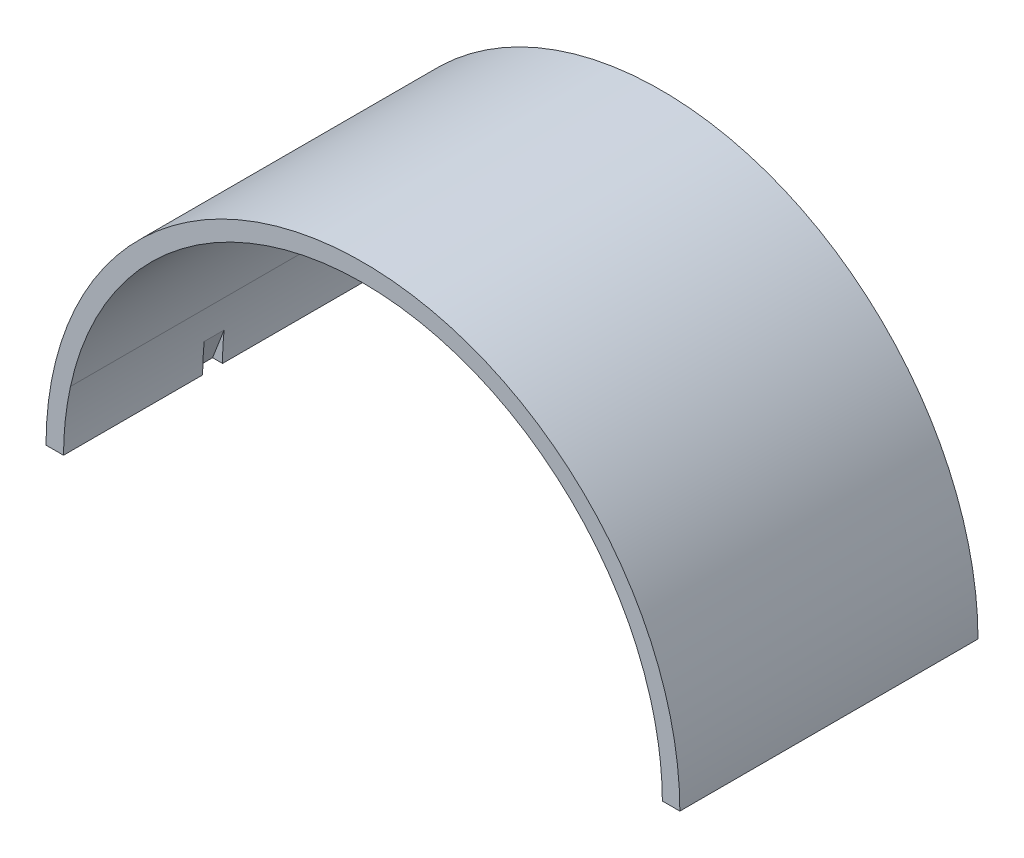
ISO-10303-21;
HEADER;
FILE_DESCRIPTION(('STEP AP214'),'2;1');
FILE_NAME('part.step','',(''),(''),'','','');
FILE_SCHEMA(('AUTOMOTIVE_DESIGN { 1 0 10303 214 1 1 1 1 }'));
ENDSEC;
DATA;
#1=APPLICATION_CONTEXT('core data for automotive mechanical design processes');
#2=APPLICATION_PROTOCOL_DEFINITION('international standard','automotive_design',2000,#1);
#3=PRODUCT_CONTEXT('',#1,'mechanical');
#4=PRODUCT('Part','Part','',(#3));
#5=PRODUCT_RELATED_PRODUCT_CATEGORY('part','',(#4));
#6=PRODUCT_DEFINITION_FORMATION('','',#4);
#7=PRODUCT_DEFINITION_CONTEXT('part definition',#1,'design');
#8=PRODUCT_DEFINITION('design','',#6,#7);
#9=PRODUCT_DEFINITION_SHAPE('','',#8);
#10=(LENGTH_UNIT() NAMED_UNIT(*) SI_UNIT(.MILLI.,.METRE.));
#11=(NAMED_UNIT(*) PLANE_ANGLE_UNIT() SI_UNIT($,.RADIAN.));
#12=(NAMED_UNIT(*) SI_UNIT($,.STERADIAN.) SOLID_ANGLE_UNIT());
#13=UNCERTAINTY_MEASURE_WITH_UNIT(LENGTH_MEASURE(1.E-05),#10,'distance_accuracy_value','');
#14=(GEOMETRIC_REPRESENTATION_CONTEXT(3) GLOBAL_UNCERTAINTY_ASSIGNED_CONTEXT((#13)) GLOBAL_UNIT_ASSIGNED_CONTEXT((#10,
#11,#12)) REPRESENTATION_CONTEXT('',''));
#15=CARTESIAN_POINT('',(0.,0.,0.));
#16=DIRECTION('',(0.,0.,1.));
#17=DIRECTION('',(1.,0.,0.));
#18=AXIS2_PLACEMENT_3D('',#15,#16,#17);
#19=CARTESIAN_POINT('',(-31.891178343949,0.,15.));
#20=DIRECTION('',(0.,1.,0.));
#21=DIRECTION('',(0.,0.,1.));
#22=AXIS2_PLACEMENT_3D('',#19,#20,#21);
#23=PLANE('',#22);
#24=DIRECTION('',(1.,0.,0.));
#25=VECTOR('',#24,1.);
#26=CARTESIAN_POINT('',(-30.5165696324547,0.,-0.999999999999994));
#27=LINE('',#26,#25);
#28=CARTESIAN_POINT('',(-31.129278343949,0.,-0.999999999999994));
#29=VERTEX_POINT('',#28);
#30=CARTESIAN_POINT('',(-30.129278343949,0.,-0.999999999999994));
#31=VERTEX_POINT('',#30);
#32=EDGE_CURVE('E151',#29,#31,#27,.T.);
#33=ORIENTED_EDGE('',*,*,#32,.F.);
#34=DIRECTION('',(0.,0.,-1.));
#35=VECTOR('',#34,1.);
#36=CARTESIAN_POINT('',(-31.129278343949,0.,-0.999999999999994));
#37=LINE('',#36,#35);
#38=CARTESIAN_POINT('',(-31.129278343949,0.,1.00000000000001));
#39=VERTEX_POINT('',#38);
#40=EDGE_CURVE('E149',#39,#29,#37,.T.);
#41=ORIENTED_EDGE('',*,*,#40,.F.);
#42=DIRECTION('',(-1.,0.,0.));
#43=VECTOR('',#42,1.);
#44=CARTESIAN_POINT('',(-30.5165696324547,0.,1.00000000000001));
#45=LINE('',#44,#43);
#46=CARTESIAN_POINT('',(-30.129278343949,0.,1.00000000000001));
#47=VERTEX_POINT('',#46);
#48=EDGE_CURVE('E136',#47,#39,#45,.T.);
#49=ORIENTED_EDGE('',*,*,#48,.F.);
#50=DIRECTION('',(0.,0.,-1.));
#51=VECTOR('',#50,1.);
#52=CARTESIAN_POINT('',(-30.129278343949,0.,15.));
#53=LINE('',#52,#51);
#54=CARTESIAN_POINT('',(-30.129278343949,0.,15.));
#55=VERTEX_POINT('',#54);
#56=EDGE_CURVE('E147',#55,#47,#53,.T.);
#57=ORIENTED_EDGE('',*,*,#56,.F.);
#58=DIRECTION('',(1.,0.,0.));
#59=VECTOR('',#58,1.);
#60=CARTESIAN_POINT('',(-31.891178343949,0.,15.));
#61=LINE('',#60,#59);
#62=CARTESIAN_POINT('',(-31.891178343949,0.,15.));
#63=VERTEX_POINT('',#62);
#64=EDGE_CURVE('E172',#63,#55,#61,.T.);
#65=ORIENTED_EDGE('',*,*,#64,.F.);
#66=DIRECTION('',(0.,0.,-1.));
#67=VECTOR('',#66,1.);
#68=CARTESIAN_POINT('',(-31.891178343949,0.,15.));
#69=LINE('',#68,#67);
#70=CARTESIAN_POINT('',(-31.891178343949,0.,1.));
#71=VERTEX_POINT('',#70);
#72=EDGE_CURVE('E11',#63,#71,#69,.T.);
#73=ORIENTED_EDGE('',*,*,#72,.T.);
#74=DIRECTION('',(1.,0.,0.));
#75=VECTOR('',#74,1.);
#76=CARTESIAN_POINT('',(-31.891178343949,0.,1.));
#77=LINE('',#76,#75);
#78=CARTESIAN_POINT('',(-32.891178343949,0.,1.));
#79=VERTEX_POINT('',#78);
#80=EDGE_CURVE('E253',#79,#71,#77,.T.);
#81=ORIENTED_EDGE('',*,*,#80,.F.);
#82=DIRECTION('',(0.,0.,1.));
#83=VECTOR('',#82,1.);
#84=CARTESIAN_POINT('',(-32.891178343949,0.,-1.));
#85=LINE('',#84,#83);
#86=CARTESIAN_POINT('',(-32.891178343949,0.,-1.));
#87=VERTEX_POINT('',#86);
#88=EDGE_CURVE('E264',#87,#79,#85,.T.);
#89=ORIENTED_EDGE('',*,*,#88,.F.);
#90=DIRECTION('',(-1.,0.,0.));
#91=VECTOR('',#90,1.);
#92=CARTESIAN_POINT('',(-31.891178343949,0.,-1.));
#93=LINE('',#92,#91);
#94=CARTESIAN_POINT('',(-31.891178343949,0.,-1.));
#95=VERTEX_POINT('',#94);
#96=EDGE_CURVE('E193',#95,#87,#93,.T.);
#97=ORIENTED_EDGE('',*,*,#96,.F.);
#98=CARTESIAN_POINT('',(-31.891178343949,0.,-15.));
#99=VERTEX_POINT('',#98);
#100=EDGE_CURVE('E52',#95,#99,#69,.T.);
#101=ORIENTED_EDGE('',*,*,#100,.T.);
#102=DIRECTION('',(1.,0.,0.));
#103=VECTOR('',#102,1.);
#104=CARTESIAN_POINT('',(-31.891178343949,0.,-15.));
#105=LINE('',#104,#103);
#106=CARTESIAN_POINT('',(-30.129278343949,0.,-15.));
#107=VERTEX_POINT('',#106);
#108=EDGE_CURVE('E180',#99,#107,#105,.T.);
#109=ORIENTED_EDGE('',*,*,#108,.T.);
#110=EDGE_CURVE('E157',#31,#107,#53,.T.);
#111=ORIENTED_EDGE('',*,*,#110,.F.);
#112=EDGE_LOOP('',(#33,#41,#49,#57,#65,#73,#81,#89,#97,#101,#109,#111));
#113=FACE_BOUND('',#112,.T.);
#114=ADVANCED_FACE('F44',(#113),#23,.F.);
#115=CARTESIAN_POINT('',(0.,-0.116742127165869,15.));
#116=DIRECTION('',(0.,0.,-1.));
#117=DIRECTION('',(-1.,0.,0.));
#118=AXIS2_PLACEMENT_3D('',#115,#116,#117);
#119=CYLINDRICAL_SURFACE('',#118,30.1295045138716);
#120=CARTESIAN_POINT('',(0.,-0.116742127165869,1.00000000000001));
#121=DIRECTION('',(0.,0.,1.));
#122=DIRECTION('',(1.,0.,0.));
#123=AXIS2_PLACEMENT_3D('',#120,#121,#122);
#124=CIRCLE('',#123,30.1295045138716);
#125=CARTESIAN_POINT('',(-29.9678654689346,2.99999999999989,1.00000000000001));
#126=VERTEX_POINT('',#125);
#127=EDGE_CURVE('E133',#126,#47,#124,.T.);
#128=ORIENTED_EDGE('',*,*,#127,.F.);
#129=DIRECTION('',(0.,0.,-1.));
#130=VECTOR('',#129,1.);
#131=CARTESIAN_POINT('',(-29.9678654689346,2.99999999999989,15.));
#132=LINE('',#131,#130);
#133=CARTESIAN_POINT('',(-29.9678654689346,2.99999999999987,-0.999999999999994));
#134=VERTEX_POINT('',#133);
#135=EDGE_CURVE('E142',#134,#126,#132,.F.);
#136=ORIENTED_EDGE('',*,*,#135,.F.);
#137=CARTESIAN_POINT('',(0.,-0.116742127165869,-0.999999999999994));
#138=DIRECTION('',(0.,0.,-1.));
#139=DIRECTION('',(-1.,0.,0.));
#140=AXIS2_PLACEMENT_3D('',#137,#138,#139);
#141=CIRCLE('',#140,30.1295045138716);
#142=EDGE_CURVE('E141',#31,#134,#141,.T.);
#143=ORIENTED_EDGE('',*,*,#142,.F.);
#144=ORIENTED_EDGE('',*,*,#110,.T.);
#145=CARTESIAN_POINT('',(0.,-0.116742127165869,-15.));
#146=DIRECTION('',(0.,0.,-1.));
#147=DIRECTION('',(-1.,0.,0.));
#148=AXIS2_PLACEMENT_3D('',#145,#146,#147);
#149=CIRCLE('',#148,30.1295045138716);
#150=CARTESIAN_POINT('',(-29.4273391340799,6.35,-15.));
#151=VERTEX_POINT('',#150);
#152=EDGE_CURVE('E198',#107,#151,#149,.T.);
#153=ORIENTED_EDGE('',*,*,#152,.T.);
#154=DIRECTION('',(0.,0.,-1.));
#155=VECTOR('',#154,1.);
#156=CARTESIAN_POINT('',(-29.4273391340799,6.35,15.));
#157=LINE('',#156,#155);
#158=CARTESIAN_POINT('',(-29.4273391340799,6.35,15.));
#159=VERTEX_POINT('',#158);
#160=EDGE_CURVE('E162',#159,#151,#157,.T.);
#161=ORIENTED_EDGE('',*,*,#160,.F.);
#162=CARTESIAN_POINT('',(0.,-0.116742127165869,15.));
#163=DIRECTION('',(0.,0.,-1.));
#164=DIRECTION('',(-1.,0.,0.));
#165=AXIS2_PLACEMENT_3D('',#162,#163,#164);
#166=CIRCLE('',#165,30.1295045138716);
#167=EDGE_CURVE('E155',#55,#159,#166,.T.);
#168=ORIENTED_EDGE('',*,*,#167,.F.);
#169=ORIENTED_EDGE('',*,*,#56,.T.);
#170=EDGE_LOOP('',(#128,#136,#143,#144,#153,#161,#168,#169));
#171=FACE_BOUND('',#170,.T.);
#172=ADVANCED_FACE('F153',(#171),#119,.F.);
#173=CARTESIAN_POINT('',(0.,0.,15.));
#174=DIRECTION('',(0.,0.,-1.));
#175=DIRECTION('',(-1.,0.,0.));
#176=AXIS2_PLACEMENT_3D('',#173,#174,#175);
#177=CYLINDRICAL_SURFACE('',#176,31.891178343949);
#178=DIRECTION('',(0.,0.,1.));
#179=VECTOR('',#178,1.);
#180=CARTESIAN_POINT('',(-31.7497599387076,3.,-1.));
#181=LINE('',#180,#179);
#182=CARTESIAN_POINT('',(-31.7497599387076,3.,-1.));
#183=VERTEX_POINT('',#182);
#184=CARTESIAN_POINT('',(-31.7497599387076,3.,1.));
#185=VERTEX_POINT('',#184);
#186=EDGE_CURVE('E201',#183,#185,#181,.T.);
#187=ORIENTED_EDGE('',*,*,#186,.T.);
#188=CARTESIAN_POINT('',(0.,0.,0.999999999999994));
#189=DIRECTION('',(0.,0.,1.));
#190=DIRECTION('',(1.,0.,0.));
#191=AXIS2_PLACEMENT_3D('',#188,#189,#190);
#192=CIRCLE('',#191,31.891178343949);
#193=EDGE_CURVE('E236',#185,#71,#192,.T.);
#194=ORIENTED_EDGE('',*,*,#193,.T.);
#195=ORIENTED_EDGE('',*,*,#72,.F.);
#196=CARTESIAN_POINT('',(0.,0.,15.));
#197=DIRECTION('',(0.,0.,1.));
#198=DIRECTION('',(-1.,0.,0.));
#199=AXIS2_PLACEMENT_3D('',#196,#197,#198);
#200=CIRCLE('',#199,31.891178343949);
#201=CARTESIAN_POINT('',(31.891178343949,0.,15.));
#202=VERTEX_POINT('',#201);
#203=EDGE_CURVE('E169',#202,#63,#200,.T.);
#204=ORIENTED_EDGE('',*,*,#203,.F.);
#205=DIRECTION('',(0.,0.,-1.));
#206=VECTOR('',#205,1.);
#207=CARTESIAN_POINT('',(31.891178343949,0.,15.));
#208=LINE('',#207,#206);
#209=CARTESIAN_POINT('',(31.891178343949,0.,-15.));
#210=VERTEX_POINT('',#209);
#211=EDGE_CURVE('E177',#202,#210,#208,.T.);
#212=ORIENTED_EDGE('',*,*,#211,.T.);
#213=CARTESIAN_POINT('',(0.,0.,-15.));
#214=DIRECTION('',(0.,0.,1.));
#215=DIRECTION('',(-1.,0.,0.));
#216=AXIS2_PLACEMENT_3D('',#213,#214,#215);
#217=CIRCLE('',#216,31.891178343949);
#218=EDGE_CURVE('E168',#210,#99,#217,.T.);
#219=ORIENTED_EDGE('',*,*,#218,.T.);
#220=ORIENTED_EDGE('',*,*,#100,.F.);
#221=CARTESIAN_POINT('',(0.,0.,-1.00000000000001));
#222=DIRECTION('',(0.,0.,-1.));
#223=DIRECTION('',(-1.,0.,0.));
#224=AXIS2_PLACEMENT_3D('',#221,#222,#223);
#225=CIRCLE('',#224,31.891178343949);
#226=EDGE_CURVE('E258',#95,#183,#225,.T.);
#227=ORIENTED_EDGE('',*,*,#226,.T.);
#228=EDGE_LOOP('',(#187,#194,#195,#204,#212,#219,#220,#227));
#229=FACE_BOUND('',#228,.T.);
#230=ADVANCED_FACE('F46',(#229),#177,.T.);
#231=CARTESIAN_POINT('',(30.472178343949,0.,15.));
#232=DIRECTION('',(0.,1.,0.));
#233=DIRECTION('',(0.,0.,1.));
#234=AXIS2_PLACEMENT_3D('',#231,#232,#233);
#235=PLANE('',#234);
#236=DIRECTION('',(1.,0.,0.));
#237=VECTOR('',#236,1.);
#238=CARTESIAN_POINT('',(30.472178343949,0.,-15.));
#239=LINE('',#238,#237);
#240=CARTESIAN_POINT('',(30.129278343949,0.,-15.));
#241=VERTEX_POINT('',#240);
#242=EDGE_CURVE('E173',#241,#210,#239,.T.);
#243=ORIENTED_EDGE('',*,*,#242,.T.);
#244=ORIENTED_EDGE('',*,*,#211,.F.);
#245=DIRECTION('',(1.,0.,0.));
#246=VECTOR('',#245,1.);
#247=CARTESIAN_POINT('',(30.472178343949,0.,15.));
#248=LINE('',#247,#246);
#249=CARTESIAN_POINT('',(30.129278343949,0.,15.));
#250=VERTEX_POINT('',#249);
#251=EDGE_CURVE('E175',#250,#202,#248,.T.);
#252=ORIENTED_EDGE('',*,*,#251,.F.);
#253=DIRECTION('',(0.,0.,-1.));
#254=VECTOR('',#253,1.);
#255=CARTESIAN_POINT('',(30.129278343949,0.,15.));
#256=LINE('',#255,#254);
#257=EDGE_CURVE('E156',#250,#241,#256,.T.);
#258=ORIENTED_EDGE('',*,*,#257,.T.);
#259=EDGE_LOOP('',(#243,#244,#252,#258));
#260=FACE_BOUND('',#259,.T.);
#261=ADVANCED_FACE('F203',(#260),#235,.F.);
#262=CARTESIAN_POINT('',(0.,0.,15.));
#263=DIRECTION('',(0.,0.,-1.));
#264=DIRECTION('',(-1.,0.,0.));
#265=AXIS2_PLACEMENT_3D('',#262,#263,#264);
#266=PLANE('',#265);
#267=ORIENTED_EDGE('',*,*,#203,.T.);
#268=ORIENTED_EDGE('',*,*,#64,.T.);
#269=ORIENTED_EDGE('',*,*,#167,.T.);
#270=CARTESIAN_POINT('',(0.,0.,15.));
#271=DIRECTION('',(0.,0.,-1.));
#272=DIRECTION('',(1.,0.,0.));
#273=AXIS2_PLACEMENT_3D('',#270,#271,#272);
#274=ELLIPSE('',#273,30.1052922759765,30.091178343949);
#275=CARTESIAN_POINT('',(29.4273391340799,6.35,15.));
#276=VERTEX_POINT('',#275);
#277=EDGE_CURVE('E230',#159,#276,#274,.T.);
#278=ORIENTED_EDGE('',*,*,#277,.T.);
#279=CARTESIAN_POINT('',(0.,-0.116742127165869,15.));
#280=DIRECTION('',(0.,0.,-1.));
#281=DIRECTION('',(-1.,0.,0.));
#282=AXIS2_PLACEMENT_3D('',#279,#280,#281);
#283=CIRCLE('',#282,30.1295045138716);
#284=EDGE_CURVE('E235',#276,#250,#283,.T.);
#285=ORIENTED_EDGE('',*,*,#284,.T.);
#286=ORIENTED_EDGE('',*,*,#251,.T.);
#287=EDGE_LOOP('',(#267,#268,#269,#278,#285,#286));
#288=FACE_BOUND('',#287,.T.);
#289=ADVANCED_FACE('F209',(#288),#266,.F.);
#290=CARTESIAN_POINT('',(0.,0.,-15.));
#291=DIRECTION('',(0.,0.,-1.));
#292=DIRECTION('',(-1.,0.,0.));
#293=AXIS2_PLACEMENT_3D('',#290,#291,#292);
#294=PLANE('',#293);
#295=ORIENTED_EDGE('',*,*,#218,.F.);
#296=ORIENTED_EDGE('',*,*,#242,.F.);
#297=CARTESIAN_POINT('',(0.,-0.116742127165869,-15.));
#298=DIRECTION('',(0.,0.,-1.));
#299=DIRECTION('',(-1.,0.,0.));
#300=AXIS2_PLACEMENT_3D('',#297,#298,#299);
#301=CIRCLE('',#300,30.1295045138716);
#302=CARTESIAN_POINT('',(29.4273391340799,6.35,-15.));
#303=VERTEX_POINT('',#302);
#304=EDGE_CURVE('E244',#303,#241,#301,.T.);
#305=ORIENTED_EDGE('',*,*,#304,.F.);
#306=CARTESIAN_POINT('',(0.,0.,-15.));
#307=DIRECTION('',(0.,0.,-1.));
#308=DIRECTION('',(1.,0.,0.));
#309=AXIS2_PLACEMENT_3D('',#306,#307,#308);
#310=ELLIPSE('',#309,30.1052922759765,30.091178343949);
#311=EDGE_CURVE('E241',#151,#303,#310,.T.);
#312=ORIENTED_EDGE('',*,*,#311,.F.);
#313=ORIENTED_EDGE('',*,*,#152,.F.);
#314=ORIENTED_EDGE('',*,*,#108,.F.);
#315=EDGE_LOOP('',(#295,#296,#305,#312,#313,#314));
#316=FACE_BOUND('',#315,.T.);
#317=ADVANCED_FACE('F196',(#316),#294,.T.);
#318=DIRECTION('',(0.,0.,-1.));
#319=VECTOR('',#318,1.);
#320=SURFACE_OF_LINEAR_EXTRUSION('',#274,#319);
#321=ORIENTED_EDGE('',*,*,#311,.T.);
#322=DIRECTION('',(0.,0.,-1.));
#323=VECTOR('',#322,1.);
#324=CARTESIAN_POINT('',(29.4273391340799,6.35,15.));
#325=LINE('',#324,#323);
#326=EDGE_CURVE('E160',#276,#303,#325,.T.);
#327=ORIENTED_EDGE('',*,*,#326,.F.);
#328=ORIENTED_EDGE('',*,*,#277,.F.);
#329=ORIENTED_EDGE('',*,*,#160,.T.);
#330=EDGE_LOOP('',(#321,#327,#328,#329));
#331=FACE_BOUND('',#330,.T.);
#332=ADVANCED_FACE('F221',(#331),#320,.F.);
#333=CARTESIAN_POINT('',(0.,-0.116742127165869,15.));
#334=DIRECTION('',(0.,0.,-1.));
#335=DIRECTION('',(-1.,0.,0.));
#336=AXIS2_PLACEMENT_3D('',#333,#334,#335);
#337=CYLINDRICAL_SURFACE('',#336,30.1295045138716);
#338=ORIENTED_EDGE('',*,*,#304,.T.);
#339=ORIENTED_EDGE('',*,*,#257,.F.);
#340=ORIENTED_EDGE('',*,*,#284,.F.);
#341=ORIENTED_EDGE('',*,*,#326,.T.);
#342=EDGE_LOOP('',(#338,#339,#340,#341));
#343=FACE_BOUND('',#342,.T.);
#344=ADVANCED_FACE('F228',(#343),#337,.F.);
#345=CARTESIAN_POINT('',(-31.891178343949,0.,1.));
#346=DIRECTION('',(0.,0.,1.));
#347=DIRECTION('',(1.,0.,0.));
#348=AXIS2_PLACEMENT_3D('',#345,#346,#347);
#349=PLANE('',#348);
#350=ORIENTED_EDGE('',*,*,#193,.F.);
#351=DIRECTION('',(0.355603869688965,0.934636767874148,0.));
#352=VECTOR('',#351,1.);
#353=CARTESIAN_POINT('',(-32.891178343949,0.,1.));
#354=LINE('',#353,#352);
#355=EDGE_CURVE('E259',#79,#185,#354,.T.);
#356=ORIENTED_EDGE('',*,*,#355,.F.);
#357=ORIENTED_EDGE('',*,*,#80,.T.);
#358=EDGE_LOOP('',(#350,#356,#357));
#359=FACE_BOUND('',#358,.T.);
#360=ADVANCED_FACE('F291',(#359),#349,.T.);
#361=CARTESIAN_POINT('',(-31.891178343949,0.,-1.));
#362=DIRECTION('',(0.,0.,-1.));
#363=DIRECTION('',(-1.,0.,0.));
#364=AXIS2_PLACEMENT_3D('',#361,#362,#363);
#365=PLANE('',#364);
#366=ORIENTED_EDGE('',*,*,#226,.F.);
#367=ORIENTED_EDGE('',*,*,#96,.T.);
#368=DIRECTION('',(0.355603869688965,0.934636767874148,0.));
#369=VECTOR('',#368,1.);
#370=CARTESIAN_POINT('',(-32.891178343949,0.,-1.));
#371=LINE('',#370,#369);
#372=EDGE_CURVE('E67',#87,#183,#371,.T.);
#373=ORIENTED_EDGE('',*,*,#372,.T.);
#374=EDGE_LOOP('',(#366,#367,#373));
#375=FACE_BOUND('',#374,.T.);
#376=ADVANCED_FACE('F289',(#375),#365,.T.);
#377=CARTESIAN_POINT('',(-32.891178343949,0.,-1.));
#378=DIRECTION('',(-0.934636767874148,0.355603869688965,0.));
#379=DIRECTION('',(-0.355603869688965,-0.934636767874148,0.));
#380=AXIS2_PLACEMENT_3D('',#377,#378,#379);
#381=PLANE('',#380);
#382=ORIENTED_EDGE('',*,*,#355,.T.);
#383=ORIENTED_EDGE('',*,*,#186,.F.);
#384=ORIENTED_EDGE('',*,*,#372,.F.);
#385=ORIENTED_EDGE('',*,*,#88,.T.);
#386=EDGE_LOOP('',(#382,#383,#384,#385));
#387=FACE_BOUND('',#386,.T.);
#388=ADVANCED_FACE('F287',(#387),#381,.T.);
#389=CARTESIAN_POINT('',(-30.5165696324547,-1.00039692215622,-0.999999999999994));
#390=DIRECTION('',(0.,0.,-1.));
#391=DIRECTION('',(-1.,0.,0.));
#392=AXIS2_PLACEMENT_3D('',#389,#390,#391);
#393=PLANE('',#392);
#394=ORIENTED_EDGE('',*,*,#142,.T.);
#395=DIRECTION('',(0.361027233469725,0.932555272728216,0.));
#396=VECTOR('',#395,1.);
#397=CARTESIAN_POINT('',(-31.5165696324547,-1.00039692215622,-0.999999999999994));
#398=LINE('',#397,#396);
#399=EDGE_CURVE('E150',#29,#134,#398,.T.);
#400=ORIENTED_EDGE('',*,*,#399,.F.);
#401=ORIENTED_EDGE('',*,*,#32,.T.);
#402=EDGE_LOOP('',(#394,#400,#401));
#403=FACE_BOUND('',#402,.T.);
#404=ADVANCED_FACE('F276',(#403),#393,.F.);
#405=CARTESIAN_POINT('',(-30.5165696324547,-1.00039692215622,1.00000000000001));
#406=DIRECTION('',(0.,0.,1.));
#407=DIRECTION('',(1.,0.,0.));
#408=AXIS2_PLACEMENT_3D('',#405,#406,#407);
#409=PLANE('',#408);
#410=ORIENTED_EDGE('',*,*,#127,.T.);
#411=ORIENTED_EDGE('',*,*,#48,.T.);
#412=DIRECTION('',(0.361027233469725,0.932555272728216,0.));
#413=VECTOR('',#412,1.);
#414=CARTESIAN_POINT('',(-31.5165696324547,-1.00039692215622,1.00000000000001));
#415=LINE('',#414,#413);
#416=EDGE_CURVE('E59',#39,#126,#415,.T.);
#417=ORIENTED_EDGE('',*,*,#416,.T.);
#418=EDGE_LOOP('',(#410,#411,#417));
#419=FACE_BOUND('',#418,.T.);
#420=ADVANCED_FACE('F135',(#419),#409,.F.);
#421=CARTESIAN_POINT('',(-31.5165696324547,-1.00039692215622,-0.999999999999994));
#422=DIRECTION('',(-0.932555272728216,0.361027233469725,0.));
#423=DIRECTION('',(-0.361027233469725,-0.932555272728216,0.));
#424=AXIS2_PLACEMENT_3D('',#421,#422,#423);
#425=PLANE('',#424);
#426=ORIENTED_EDGE('',*,*,#135,.T.);
#427=ORIENTED_EDGE('',*,*,#416,.F.);
#428=ORIENTED_EDGE('',*,*,#40,.T.);
#429=ORIENTED_EDGE('',*,*,#399,.T.);
#430=EDGE_LOOP('',(#426,#427,#428,#429));
#431=FACE_BOUND('',#430,.T.);
#432=ADVANCED_FACE('F277',(#431),#425,.F.);
#433=CLOSED_SHELL('',(#114,#172,#230,#261,#289,#317,#332,#344,#360,#376,#388,#404,#420,#432));
#434=MANIFOLD_SOLID_BREP('B2',#433);
#435=ADVANCED_BREP_SHAPE_REPRESENTATION('',(#18,#434),#14);
#436=SHAPE_DEFINITION_REPRESENTATION(#9,#435);
ENDSEC;
END-ISO-10303-21;
